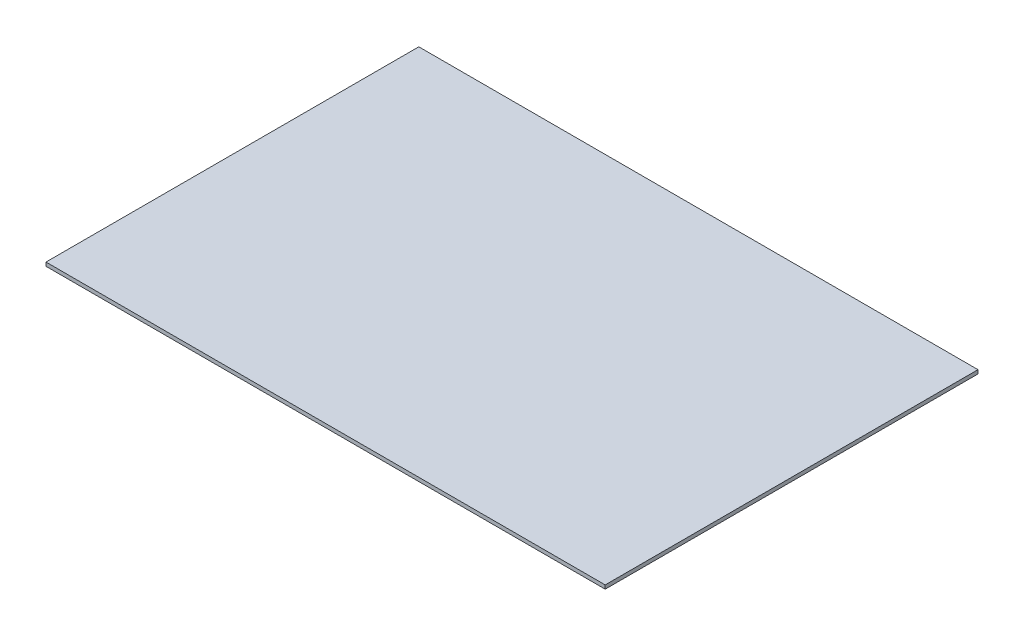
ISO-10303-21;
HEADER;
FILE_DESCRIPTION(('STEP AP214'),'2;1');
FILE_NAME('part.step','',(''),(''),'','','');
FILE_SCHEMA(('AUTOMOTIVE_DESIGN { 1 0 10303 214 1 1 1 1 }'));
ENDSEC;
DATA;
#1=APPLICATION_CONTEXT('core data for automotive mechanical design processes');
#2=APPLICATION_PROTOCOL_DEFINITION('international standard','automotive_design',2000,#1);
#3=PRODUCT_CONTEXT('',#1,'mechanical');
#4=PRODUCT('Part','Part','',(#3));
#5=PRODUCT_RELATED_PRODUCT_CATEGORY('part','',(#4));
#6=PRODUCT_DEFINITION_FORMATION('','',#4);
#7=PRODUCT_DEFINITION_CONTEXT('part definition',#1,'design');
#8=PRODUCT_DEFINITION('design','',#6,#7);
#9=PRODUCT_DEFINITION_SHAPE('','',#8);
#10=(LENGTH_UNIT() NAMED_UNIT(*) SI_UNIT(.MILLI.,.METRE.));
#11=(NAMED_UNIT(*) PLANE_ANGLE_UNIT() SI_UNIT($,.RADIAN.));
#12=(NAMED_UNIT(*) SI_UNIT($,.STERADIAN.) SOLID_ANGLE_UNIT());
#13=UNCERTAINTY_MEASURE_WITH_UNIT(LENGTH_MEASURE(1.E-05),#10,'distance_accuracy_value','');
#14=(GEOMETRIC_REPRESENTATION_CONTEXT(3) GLOBAL_UNCERTAINTY_ASSIGNED_CONTEXT((#13)) GLOBAL_UNIT_ASSIGNED_CONTEXT((#10,
#11,#12)) REPRESENTATION_CONTEXT('',''));
#15=CARTESIAN_POINT('',(0.,0.,0.));
#16=DIRECTION('',(0.,0.,1.));
#17=DIRECTION('',(1.,0.,0.));
#18=AXIS2_PLACEMENT_3D('',#15,#16,#17);
#19=CARTESIAN_POINT('',(750.,5.,-500.));
#20=DIRECTION('',(-1.,0.,0.));
#21=DIRECTION('',(0.,0.,1.));
#22=AXIS2_PLACEMENT_3D('',#19,#20,#21);
#23=PLANE('',#22);
#24=DIRECTION('',(0.,0.,-1.));
#25=VECTOR('',#24,1.);
#26=CARTESIAN_POINT('',(750.,-5.,-500.));
#27=LINE('',#26,#25);
#28=CARTESIAN_POINT('',(750.,-5.,500.));
#29=VERTEX_POINT('',#28);
#30=CARTESIAN_POINT('',(750.,-5.,-500.));
#31=VERTEX_POINT('',#30);
#32=EDGE_CURVE('E100',#29,#31,#27,.T.);
#33=ORIENTED_EDGE('',*,*,#32,.T.);
#34=DIRECTION('',(0.,-1.,0.));
#35=VECTOR('',#34,1.);
#36=CARTESIAN_POINT('',(750.,5.,-500.));
#37=LINE('',#36,#35);
#38=CARTESIAN_POINT('',(750.,5.,-500.));
#39=VERTEX_POINT('',#38);
#40=EDGE_CURVE('E11',#39,#31,#37,.T.);
#41=ORIENTED_EDGE('',*,*,#40,.F.);
#42=DIRECTION('',(0.,0.,-1.));
#43=VECTOR('',#42,1.);
#44=CARTESIAN_POINT('',(750.,5.,-500.));
#45=LINE('',#44,#43);
#46=CARTESIAN_POINT('',(750.,5.,500.));
#47=VERTEX_POINT('',#46);
#48=EDGE_CURVE('E88',#47,#39,#45,.T.);
#49=ORIENTED_EDGE('',*,*,#48,.F.);
#50=DIRECTION('',(0.,-1.,0.));
#51=VECTOR('',#50,1.);
#52=CARTESIAN_POINT('',(750.,5.,500.));
#53=LINE('',#52,#51);
#54=EDGE_CURVE('E96',#47,#29,#53,.T.);
#55=ORIENTED_EDGE('',*,*,#54,.T.);
#56=EDGE_LOOP('',(#33,#41,#49,#55));
#57=FACE_BOUND('',#56,.T.);
#58=ADVANCED_FACE('F37',(#57),#23,.F.);
#59=CARTESIAN_POINT('',(-750.,5.,-500.));
#60=DIRECTION('',(0.,0.,1.));
#61=DIRECTION('',(1.,0.,0.));
#62=AXIS2_PLACEMENT_3D('',#59,#60,#61);
#63=PLANE('',#62);
#64=DIRECTION('',(-1.,0.,0.));
#65=VECTOR('',#64,1.);
#66=CARTESIAN_POINT('',(-750.,-5.,-500.));
#67=LINE('',#66,#65);
#68=CARTESIAN_POINT('',(-750.,-5.,-500.));
#69=VERTEX_POINT('',#68);
#70=EDGE_CURVE('E92',#31,#69,#67,.T.);
#71=ORIENTED_EDGE('',*,*,#70,.T.);
#72=DIRECTION('',(0.,-1.,0.));
#73=VECTOR('',#72,1.);
#74=CARTESIAN_POINT('',(-750.,5.,-500.));
#75=LINE('',#74,#73);
#76=CARTESIAN_POINT('',(-750.,5.,-500.));
#77=VERTEX_POINT('',#76);
#78=EDGE_CURVE('E45',#77,#69,#75,.T.);
#79=ORIENTED_EDGE('',*,*,#78,.F.);
#80=DIRECTION('',(-1.,0.,0.));
#81=VECTOR('',#80,1.);
#82=CARTESIAN_POINT('',(-750.,5.,-500.));
#83=LINE('',#82,#81);
#84=EDGE_CURVE('E83',#39,#77,#83,.T.);
#85=ORIENTED_EDGE('',*,*,#84,.F.);
#86=ORIENTED_EDGE('',*,*,#40,.T.);
#87=EDGE_LOOP('',(#71,#79,#85,#86));
#88=FACE_BOUND('',#87,.T.);
#89=ADVANCED_FACE('F91',(#88),#63,.F.);
#90=CARTESIAN_POINT('',(-750.,5.,-500.));
#91=DIRECTION('',(1.,0.,0.));
#92=DIRECTION('',(0.,0.,-1.));
#93=AXIS2_PLACEMENT_3D('',#90,#91,#92);
#94=PLANE('',#93);
#95=DIRECTION('',(0.,0.,1.));
#96=VECTOR('',#95,1.);
#97=CARTESIAN_POINT('',(-750.,-5.,-500.));
#98=LINE('',#97,#96);
#99=CARTESIAN_POINT('',(-750.,-5.,500.));
#100=VERTEX_POINT('',#99);
#101=EDGE_CURVE('E70',#69,#100,#98,.T.);
#102=ORIENTED_EDGE('',*,*,#101,.T.);
#103=DIRECTION('',(0.,-1.,0.));
#104=VECTOR('',#103,1.);
#105=CARTESIAN_POINT('',(-750.,5.,500.));
#106=LINE('',#105,#104);
#107=CARTESIAN_POINT('',(-750.,5.,500.));
#108=VERTEX_POINT('',#107);
#109=EDGE_CURVE('E93',#108,#100,#106,.T.);
#110=ORIENTED_EDGE('',*,*,#109,.F.);
#111=DIRECTION('',(0.,0.,1.));
#112=VECTOR('',#111,1.);
#113=CARTESIAN_POINT('',(-750.,5.,-500.));
#114=LINE('',#113,#112);
#115=EDGE_CURVE('E86',#77,#108,#114,.T.);
#116=ORIENTED_EDGE('',*,*,#115,.F.);
#117=ORIENTED_EDGE('',*,*,#78,.T.);
#118=EDGE_LOOP('',(#102,#110,#116,#117));
#119=FACE_BOUND('',#118,.T.);
#120=ADVANCED_FACE('F94',(#119),#94,.F.);
#121=CARTESIAN_POINT('',(-750.,5.,500.));
#122=DIRECTION('',(0.,0.,-1.));
#123=DIRECTION('',(-1.,0.,0.));
#124=AXIS2_PLACEMENT_3D('',#121,#122,#123);
#125=PLANE('',#124);
#126=DIRECTION('',(1.,0.,0.));
#127=VECTOR('',#126,1.);
#128=CARTESIAN_POINT('',(-750.,-5.,500.));
#129=LINE('',#128,#127);
#130=EDGE_CURVE('E76',#100,#29,#129,.T.);
#131=ORIENTED_EDGE('',*,*,#130,.T.);
#132=ORIENTED_EDGE('',*,*,#54,.F.);
#133=DIRECTION('',(1.,0.,0.));
#134=VECTOR('',#133,1.);
#135=CARTESIAN_POINT('',(-750.,5.,500.));
#136=LINE('',#135,#134);
#137=EDGE_CURVE('E53',#108,#47,#136,.T.);
#138=ORIENTED_EDGE('',*,*,#137,.F.);
#139=ORIENTED_EDGE('',*,*,#109,.T.);
#140=EDGE_LOOP('',(#131,#132,#138,#139));
#141=FACE_BOUND('',#140,.T.);
#142=ADVANCED_FACE('F107',(#141),#125,.F.);
#143=CARTESIAN_POINT('',(0.,5.,0.));
#144=DIRECTION('',(0.,1.,0.));
#145=DIRECTION('',(0.,0.,1.));
#146=AXIS2_PLACEMENT_3D('',#143,#144,#145);
#147=PLANE('',#146);
#148=ORIENTED_EDGE('',*,*,#48,.T.);
#149=ORIENTED_EDGE('',*,*,#84,.T.);
#150=ORIENTED_EDGE('',*,*,#115,.T.);
#151=ORIENTED_EDGE('',*,*,#137,.T.);
#152=EDGE_LOOP('',(#148,#149,#150,#151));
#153=FACE_BOUND('',#152,.T.);
#154=ADVANCED_FACE('F84',(#153),#147,.T.);
#155=CARTESIAN_POINT('',(0.,-5.,0.));
#156=DIRECTION('',(0.,1.,0.));
#157=DIRECTION('',(0.,0.,1.));
#158=AXIS2_PLACEMENT_3D('',#155,#156,#157);
#159=PLANE('',#158);
#160=ORIENTED_EDGE('',*,*,#32,.F.);
#161=ORIENTED_EDGE('',*,*,#130,.F.);
#162=ORIENTED_EDGE('',*,*,#101,.F.);
#163=ORIENTED_EDGE('',*,*,#70,.F.);
#164=EDGE_LOOP('',(#160,#161,#162,#163));
#165=FACE_BOUND('',#164,.T.);
#166=ADVANCED_FACE('F110',(#165),#159,.F.);
#167=CLOSED_SHELL('',(#58,#89,#120,#142,#154,#166));
#168=MANIFOLD_SOLID_BREP('B2',#167);
#169=ADVANCED_BREP_SHAPE_REPRESENTATION('',(#18,#168),#14);
#170=SHAPE_DEFINITION_REPRESENTATION(#9,#169);
ENDSEC;
END-ISO-10303-21;
